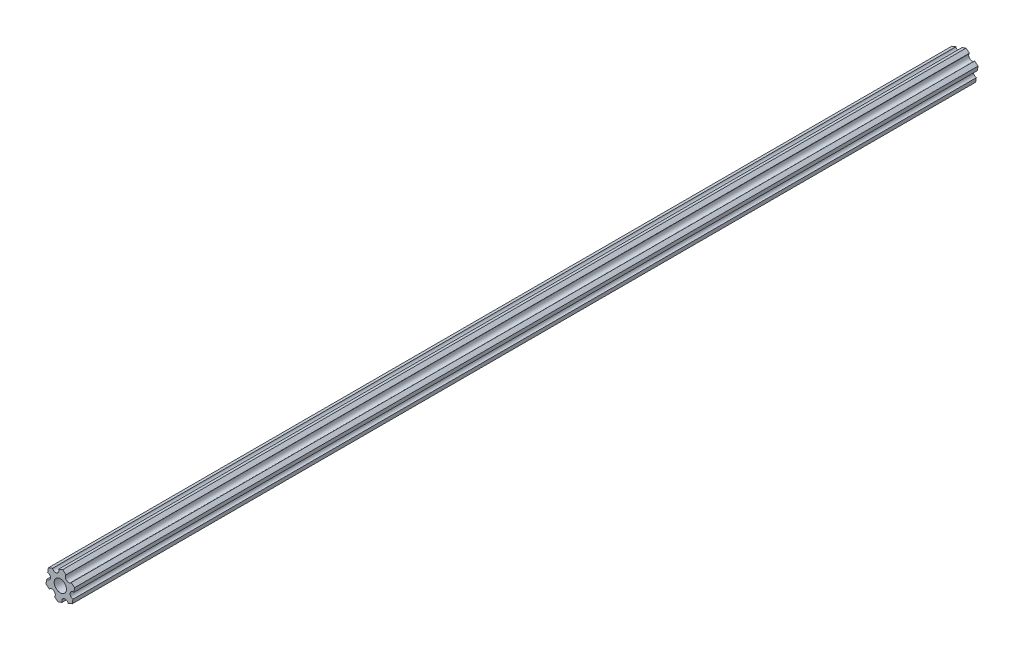
ISO-10303-21;
HEADER;
FILE_DESCRIPTION(('STEP AP214'),'2;1');
FILE_NAME('part.step','',(''),(''),'','','');
FILE_SCHEMA(('AUTOMOTIVE_DESIGN { 1 0 10303 214 1 1 1 1 }'));
ENDSEC;
DATA;
#1=APPLICATION_CONTEXT('core data for automotive mechanical design processes');
#2=APPLICATION_PROTOCOL_DEFINITION('international standard','automotive_design',2000,#1);
#3=PRODUCT_CONTEXT('',#1,'mechanical');
#4=PRODUCT('Part','Part','',(#3));
#5=PRODUCT_RELATED_PRODUCT_CATEGORY('part','',(#4));
#6=PRODUCT_DEFINITION_FORMATION('','',#4);
#7=PRODUCT_DEFINITION_CONTEXT('part definition',#1,'design');
#8=PRODUCT_DEFINITION('design','',#6,#7);
#9=PRODUCT_DEFINITION_SHAPE('','',#8);
#10=(LENGTH_UNIT() NAMED_UNIT(*) SI_UNIT(.MILLI.,.METRE.));
#11=(NAMED_UNIT(*) PLANE_ANGLE_UNIT() SI_UNIT($,.RADIAN.));
#12=(NAMED_UNIT(*) SI_UNIT($,.STERADIAN.) SOLID_ANGLE_UNIT());
#13=UNCERTAINTY_MEASURE_WITH_UNIT(LENGTH_MEASURE(1.E-05),#10,'distance_accuracy_value','');
#14=(GEOMETRIC_REPRESENTATION_CONTEXT(3) GLOBAL_UNCERTAINTY_ASSIGNED_CONTEXT((#13)) GLOBAL_UNIT_ASSIGNED_CONTEXT((#10,
#11,#12)) REPRESENTATION_CONTEXT('',''));
#15=CARTESIAN_POINT('',(0.,0.,0.));
#16=DIRECTION('',(0.,0.,1.));
#17=DIRECTION('',(1.,0.,0.));
#18=AXIS2_PLACEMENT_3D('',#15,#16,#17);
#19=CARTESIAN_POINT('',(-2.28494257052432,5.92465504898013,431.8));
#20=DIRECTION('',(0.,0.,1.));
#21=DIRECTION('',(1.,0.,0.));
#22=AXIS2_PLACEMENT_3D('',#19,#20,#21);
#23=PLANE('',#22);
#24=DIRECTION('',(-0.778133202638211,0.628099290679428,0.));
#25=VECTOR('',#24,1.);
#26=CARTESIAN_POINT('',(2.7531440366259,5.93825346070648,431.8));
#27=LINE('',#26,#25);
#28=CARTESIAN_POINT('',(2.7531440366259,5.93825346070648,431.8));
#29=VERTEX_POINT('',#28);
#30=CARTESIAN_POINT('',(1.13565861686004,7.24386725715518,431.8));
#31=VERTEX_POINT('',#30);
#32=EDGE_CURVE('E225',#29,#31,#27,.T.);
#33=ORIENTED_EDGE('',*,*,#32,.T.);
#34=DIRECTION('',(-0.933016543146477,-0.359833475673121,0.));
#35=VECTOR('',#34,1.);
#36=CARTESIAN_POINT('',(1.13565861686004,7.24386725715518,431.8));
#37=LINE('',#36,#35);
#38=CARTESIAN_POINT('',(-0.803778808279283,6.49589069161121,431.8));
#39=VERTEX_POINT('',#38);
#40=EDGE_CURVE('E123',#31,#39,#37,.T.);
#41=ORIENTED_EDGE('',*,*,#40,.T.);
#42=CARTESIAN_POINT('',(-2.28494257052432,5.92465504898013,431.8));
#43=DIRECTION('',(0.,0.,-1.));
#44=DIRECTION('',(1.,0.,0.));
#45=AXIS2_PLACEMENT_3D('',#42,#43,#44);
#46=CIRCLE('',#45,1.5875);
#47=CARTESIAN_POINT('',(-3.76610633276935,5.35341940634905,431.8));
#48=VERTEX_POINT('',#47);
#49=EDGE_CURVE('E270',#39,#48,#46,.T.);
#50=ORIENTED_EDGE('',*,*,#49,.T.);
#51=DIRECTION('',(-0.933016543146477,-0.359833475673121,0.));
#52=VECTOR('',#51,1.);
#53=CARTESIAN_POINT('',(-3.76610633276935,5.35341940634905,431.8));
#54=LINE('',#53,#52);
#55=CARTESIAN_POINT('',(-5.70554375790867,4.60544284080508,431.8));
#56=VERTEX_POINT('',#55);
#57=EDGE_CURVE('E289',#48,#56,#54,.T.);
#58=ORIENTED_EDGE('',*,*,#57,.T.);
#59=DIRECTION('',(-0.154883340508266,-0.987932766352549,0.));
#60=VECTOR('',#59,1.);
#61=CARTESIAN_POINT('',(-5.70554375790867,4.60544284080508,431.8));
#62=LINE('',#61,#60);
#63=CARTESIAN_POINT('',(-6.02749576328176,2.5518524788125,431.8));
#64=VERTEX_POINT('',#63);
#65=EDGE_CURVE('E286',#56,#64,#62,.T.);
#66=ORIENTED_EDGE('',*,*,#65,.T.);
#67=CARTESIAN_POINT('',(-6.27337306633831,0.983509212227633,431.8));
#68=DIRECTION('',(0.,0.,-1.));
#69=DIRECTION('',(1.,0.,0.));
#70=AXIS2_PLACEMENT_3D('',#67,#68,#69);
#71=CIRCLE('',#70,1.5875);
#72=CARTESIAN_POINT('',(-6.51925036939553,-0.584834054356986,431.8));
#73=VERTEX_POINT('',#72);
#74=EDGE_CURVE('E288',#64,#73,#71,.T.);
#75=ORIENTED_EDGE('',*,*,#74,.T.);
#76=DIRECTION('',(-0.154883340508266,-0.987932766352549,0.));
#77=VECTOR('',#76,1.);
#78=CARTESIAN_POINT('',(-6.5192503693955,-0.584834054356841,431.8));
#79=LINE('',#78,#77);
#80=CARTESIAN_POINT('',(-6.8412023747687,-2.6384244163501,431.8));
#81=VERTEX_POINT('',#80);
#82=EDGE_CURVE('E291',#73,#81,#79,.T.);
#83=ORIENTED_EDGE('',*,*,#82,.T.);
#84=DIRECTION('',(0.778133202638211,-0.628099290679428,0.));
#85=VECTOR('',#84,1.);
#86=CARTESIAN_POINT('',(-6.8412023747687,-2.6384244163501,431.8));
#87=LINE('',#86,#85);
#88=CARTESIAN_POINT('',(-5.22371695500254,-3.94403821279904,431.8));
#89=VERTEX_POINT('',#88);
#90=EDGE_CURVE('E297',#81,#89,#87,.T.);
#91=ORIENTED_EDGE('',*,*,#90,.T.);
#92=CARTESIAN_POINT('',(-3.98843049581394,-4.9411458367521,431.8));
#93=DIRECTION('',(0.,0.,-1.));
#94=DIRECTION('',(1.,0.,0.));
#95=AXIS2_PLACEMENT_3D('',#92,#93,#94);
#96=CIRCLE('',#95,1.58750000000001);
#97=CARTESIAN_POINT('',(-2.7531440366262,-5.93825346070624,431.8));
#98=VERTEX_POINT('',#97);
#99=EDGE_CURVE('E299',#89,#98,#96,.T.);
#100=ORIENTED_EDGE('',*,*,#99,.T.);
#101=DIRECTION('',(0.778133202638211,-0.628099290679428,0.));
#102=VECTOR('',#101,1.);
#103=CARTESIAN_POINT('',(-2.7531440366262,-5.93825346070624,431.8));
#104=LINE('',#103,#102);
#105=CARTESIAN_POINT('',(-1.13565861686003,-7.24386725715518,431.8));
#106=VERTEX_POINT('',#105);
#107=EDGE_CURVE('E301',#98,#106,#104,.T.);
#108=ORIENTED_EDGE('',*,*,#107,.T.);
#109=DIRECTION('',(0.933016543146476,0.359833475673123,0.));
#110=VECTOR('',#109,1.);
#111=CARTESIAN_POINT('',(-1.13565861686003,-7.24386725715518,431.8));
#112=LINE('',#111,#110);
#113=CARTESIAN_POINT('',(0.803778808279654,-6.49589069161106,431.8));
#114=VERTEX_POINT('',#113);
#115=EDGE_CURVE('E303',#106,#114,#112,.T.);
#116=ORIENTED_EDGE('',*,*,#115,.T.);
#117=CARTESIAN_POINT('',(2.28494257052444,-5.92465504897934,431.8));
#118=DIRECTION('',(0.,0.,-1.));
#119=DIRECTION('',(1.,0.,0.));
#120=AXIS2_PLACEMENT_3D('',#117,#118,#119);
#121=CIRCLE('',#120,1.5875);
#122=CARTESIAN_POINT('',(3.76610633276972,-5.35341940634891,431.8));
#123=VERTEX_POINT('',#122);
#124=EDGE_CURVE('E305',#114,#123,#121,.T.);
#125=ORIENTED_EDGE('',*,*,#124,.T.);
#126=DIRECTION('',(0.933016543146476,0.359833475673122,0.));
#127=VECTOR('',#126,1.);
#128=CARTESIAN_POINT('',(3.76610633276972,-5.35341940634891,431.8));
#129=LINE('',#128,#127);
#130=CARTESIAN_POINT('',(5.70554375790867,-4.60544284080507,431.8));
#131=VERTEX_POINT('',#130);
#132=EDGE_CURVE('E307',#123,#131,#129,.T.);
#133=ORIENTED_EDGE('',*,*,#132,.T.);
#134=DIRECTION('',(0.154883340508265,0.987932766352549,0.));
#135=VECTOR('',#134,1.);
#136=CARTESIAN_POINT('',(5.70554375790867,-4.60544284080507,431.8));
#137=LINE('',#136,#135);
#138=CARTESIAN_POINT('',(6.02749576328191,-2.55185247881157,431.8));
#139=VERTEX_POINT('',#138);
#140=EDGE_CURVE('E309',#131,#139,#137,.T.);
#141=ORIENTED_EDGE('',*,*,#140,.T.);
#142=CARTESIAN_POINT('',(6.27337306633844,-0.983509212226843,431.8));
#143=DIRECTION('',(0.,0.,-1.));
#144=DIRECTION('',(1.,0.,0.));
#145=AXIS2_PLACEMENT_3D('',#142,#143,#144);
#146=CIRCLE('',#145,1.5875);
#147=CARTESIAN_POINT('',(6.51925036939565,0.584834054357775,431.8));
#148=VERTEX_POINT('',#147);
#149=EDGE_CURVE('E172',#139,#148,#146,.T.);
#150=ORIENTED_EDGE('',*,*,#149,.T.);
#151=DIRECTION('',(0.154883340508267,0.987932766352549,0.));
#152=VECTOR('',#151,1.);
#153=CARTESIAN_POINT('',(6.51925036939565,0.584834054357776,431.8));
#154=LINE('',#153,#152);
#155=CARTESIAN_POINT('',(6.84120237476871,2.6384244163501,431.8));
#156=VERTEX_POINT('',#155);
#157=EDGE_CURVE('E166',#148,#156,#154,.T.);
#158=ORIENTED_EDGE('',*,*,#157,.T.);
#159=DIRECTION('',(-0.778133202638211,0.628099290679428,0.));
#160=VECTOR('',#159,1.);
#161=CARTESIAN_POINT('',(6.84120237476871,2.6384244163501,431.8));
#162=LINE('',#161,#160);
#163=CARTESIAN_POINT('',(5.22371695500222,3.9440382127993,431.8));
#164=VERTEX_POINT('',#163);
#165=EDGE_CURVE('E170',#156,#164,#162,.T.);
#166=ORIENTED_EDGE('',*,*,#165,.T.);
#167=CARTESIAN_POINT('',(3.98843049581406,4.94114583675289,431.8));
#168=DIRECTION('',(0.,0.,-1.));
#169=DIRECTION('',(1.,0.,0.));
#170=AXIS2_PLACEMENT_3D('',#167,#168,#169);
#171=CIRCLE('',#170,1.5875);
#172=EDGE_CURVE('E50',#164,#29,#171,.T.);
#173=ORIENTED_EDGE('',*,*,#172,.T.);
#174=EDGE_LOOP('',(#33,#41,#50,#58,#66,#75,#83,#91,#100,#108,#116,#125,#133,#141,#150,#158,#166,#173));
#175=FACE_BOUND('',#174,.T.);
#176=CARTESIAN_POINT('',(0.,0.,431.8));
#177=DIRECTION('',(0.,0.,1.));
#178=DIRECTION('',(1.,0.,0.));
#179=AXIS2_PLACEMENT_3D('',#176,#177,#178);
#180=CIRCLE('',#179,2.9337);
#181=CARTESIAN_POINT('',(2.9337,0.,431.8));
#182=VERTEX_POINT('',#181);
#183=EDGE_CURVE('E194',#182,#182,#180,.T.);
#184=ORIENTED_EDGE('',*,*,#183,.F.);
#185=EDGE_LOOP('',(#184));
#186=FACE_BOUND('',#185,.T.);
#187=ADVANCED_FACE('F33',(#175,#186),#23,.T.);
#188=CARTESIAN_POINT('',(-2.28494257052432,5.92465504898013,0.));
#189=DIRECTION('',(0.,0.,1.));
#190=DIRECTION('',(1.,0.,0.));
#191=AXIS2_PLACEMENT_3D('',#188,#189,#190);
#192=PLANE('',#191);
#193=DIRECTION('',(-0.778133202638211,0.628099290679428,0.));
#194=VECTOR('',#193,1.);
#195=CARTESIAN_POINT('',(2.7531440366259,5.93825346070648,0.));
#196=LINE('',#195,#194);
#197=CARTESIAN_POINT('',(2.7531440366259,5.93825346070648,0.));
#198=VERTEX_POINT('',#197);
#199=CARTESIAN_POINT('',(1.13565861686004,7.24386725715518,0.));
#200=VERTEX_POINT('',#199);
#201=EDGE_CURVE('E190',#198,#200,#196,.T.);
#202=ORIENTED_EDGE('',*,*,#201,.F.);
#203=CARTESIAN_POINT('',(3.98843049581406,4.94114583675289,0.));
#204=DIRECTION('',(0.,0.,-1.));
#205=DIRECTION('',(1.,0.,0.));
#206=AXIS2_PLACEMENT_3D('',#203,#204,#205);
#207=CIRCLE('',#206,1.5875);
#208=CARTESIAN_POINT('',(5.22371695500222,3.9440382127993,0.));
#209=VERTEX_POINT('',#208);
#210=EDGE_CURVE('E115',#209,#198,#207,.T.);
#211=ORIENTED_EDGE('',*,*,#210,.F.);
#212=DIRECTION('',(-0.778133202638211,0.628099290679428,0.));
#213=VECTOR('',#212,1.);
#214=CARTESIAN_POINT('',(6.84120237476871,2.6384244163501,0.));
#215=LINE('',#214,#213);
#216=CARTESIAN_POINT('',(6.84120237476871,2.6384244163501,0.));
#217=VERTEX_POINT('',#216);
#218=EDGE_CURVE('E109',#217,#209,#215,.T.);
#219=ORIENTED_EDGE('',*,*,#218,.F.);
#220=DIRECTION('',(0.154883340508267,0.987932766352549,0.));
#221=VECTOR('',#220,1.);
#222=CARTESIAN_POINT('',(6.51925036939565,0.584834054357776,0.));
#223=LINE('',#222,#221);
#224=CARTESIAN_POINT('',(6.51925036939565,0.584834054357775,0.));
#225=VERTEX_POINT('',#224);
#226=EDGE_CURVE('E180',#225,#217,#223,.T.);
#227=ORIENTED_EDGE('',*,*,#226,.F.);
#228=CARTESIAN_POINT('',(6.27337306633844,-0.983509212226843,0.));
#229=DIRECTION('',(0.,0.,-1.));
#230=DIRECTION('',(1.,0.,0.));
#231=AXIS2_PLACEMENT_3D('',#228,#229,#230);
#232=CIRCLE('',#231,1.5875);
#233=CARTESIAN_POINT('',(6.02749576328191,-2.55185247881157,0.));
#234=VERTEX_POINT('',#233);
#235=EDGE_CURVE('E220',#234,#225,#232,.T.);
#236=ORIENTED_EDGE('',*,*,#235,.F.);
#237=DIRECTION('',(0.154883340508265,0.987932766352549,0.));
#238=VECTOR('',#237,1.);
#239=CARTESIAN_POINT('',(5.70554375790867,-4.60544284080507,0.));
#240=LINE('',#239,#238);
#241=CARTESIAN_POINT('',(5.70554375790867,-4.60544284080507,0.));
#242=VERTEX_POINT('',#241);
#243=EDGE_CURVE('E218',#242,#234,#240,.T.);
#244=ORIENTED_EDGE('',*,*,#243,.F.);
#245=DIRECTION('',(0.933016543146476,0.359833475673122,0.));
#246=VECTOR('',#245,1.);
#247=CARTESIAN_POINT('',(3.76610633276972,-5.35341940634891,0.));
#248=LINE('',#247,#246);
#249=CARTESIAN_POINT('',(3.76610633276972,-5.35341940634891,0.));
#250=VERTEX_POINT('',#249);
#251=EDGE_CURVE('E216',#250,#242,#248,.T.);
#252=ORIENTED_EDGE('',*,*,#251,.F.);
#253=CARTESIAN_POINT('',(2.28494257052444,-5.92465504897934,0.));
#254=DIRECTION('',(0.,0.,-1.));
#255=DIRECTION('',(1.,0.,0.));
#256=AXIS2_PLACEMENT_3D('',#253,#254,#255);
#257=CIRCLE('',#256,1.5875);
#258=CARTESIAN_POINT('',(0.803778808279654,-6.49589069161106,0.));
#259=VERTEX_POINT('',#258);
#260=EDGE_CURVE('E214',#259,#250,#257,.T.);
#261=ORIENTED_EDGE('',*,*,#260,.F.);
#262=DIRECTION('',(0.933016543146476,0.359833475673123,0.));
#263=VECTOR('',#262,1.);
#264=CARTESIAN_POINT('',(-1.13565861686003,-7.24386725715518,0.));
#265=LINE('',#264,#263);
#266=CARTESIAN_POINT('',(-1.13565861686003,-7.24386725715518,0.));
#267=VERTEX_POINT('',#266);
#268=EDGE_CURVE('E212',#267,#259,#265,.T.);
#269=ORIENTED_EDGE('',*,*,#268,.F.);
#270=DIRECTION('',(0.778133202638211,-0.628099290679428,0.));
#271=VECTOR('',#270,1.);
#272=CARTESIAN_POINT('',(-2.7531440366262,-5.93825346070624,0.));
#273=LINE('',#272,#271);
#274=CARTESIAN_POINT('',(-2.7531440366262,-5.93825346070624,0.));
#275=VERTEX_POINT('',#274);
#276=EDGE_CURVE('E210',#275,#267,#273,.T.);
#277=ORIENTED_EDGE('',*,*,#276,.F.);
#278=CARTESIAN_POINT('',(-3.98843049581394,-4.9411458367521,0.));
#279=DIRECTION('',(0.,0.,-1.));
#280=DIRECTION('',(1.,0.,0.));
#281=AXIS2_PLACEMENT_3D('',#278,#279,#280);
#282=CIRCLE('',#281,1.58750000000001);
#283=CARTESIAN_POINT('',(-5.22371695500254,-3.94403821279904,0.));
#284=VERTEX_POINT('',#283);
#285=EDGE_CURVE('E208',#284,#275,#282,.T.);
#286=ORIENTED_EDGE('',*,*,#285,.F.);
#287=DIRECTION('',(0.778133202638211,-0.628099290679428,0.));
#288=VECTOR('',#287,1.);
#289=CARTESIAN_POINT('',(-6.8412023747687,-2.6384244163501,0.));
#290=LINE('',#289,#288);
#291=CARTESIAN_POINT('',(-6.8412023747687,-2.6384244163501,0.));
#292=VERTEX_POINT('',#291);
#293=EDGE_CURVE('E206',#292,#284,#290,.T.);
#294=ORIENTED_EDGE('',*,*,#293,.F.);
#295=DIRECTION('',(-0.154883340508266,-0.987932766352549,0.));
#296=VECTOR('',#295,1.);
#297=CARTESIAN_POINT('',(-6.5192503693955,-0.584834054356841,0.));
#298=LINE('',#297,#296);
#299=CARTESIAN_POINT('',(-6.51925036939553,-0.584834054356986,0.));
#300=VERTEX_POINT('',#299);
#301=EDGE_CURVE('E204',#300,#292,#298,.T.);
#302=ORIENTED_EDGE('',*,*,#301,.F.);
#303=CARTESIAN_POINT('',(-6.27337306633831,0.983509212227633,0.));
#304=DIRECTION('',(0.,0.,-1.));
#305=DIRECTION('',(1.,0.,0.));
#306=AXIS2_PLACEMENT_3D('',#303,#304,#305);
#307=CIRCLE('',#306,1.5875);
#308=CARTESIAN_POINT('',(-6.02749576328176,2.5518524788125,0.));
#309=VERTEX_POINT('',#308);
#310=EDGE_CURVE('E202',#309,#300,#307,.T.);
#311=ORIENTED_EDGE('',*,*,#310,.F.);
#312=DIRECTION('',(-0.154883340508266,-0.987932766352549,0.));
#313=VECTOR('',#312,1.);
#314=CARTESIAN_POINT('',(-5.70554375790867,4.60544284080508,0.));
#315=LINE('',#314,#313);
#316=CARTESIAN_POINT('',(-5.70554375790867,4.60544284080508,0.));
#317=VERTEX_POINT('',#316);
#318=EDGE_CURVE('E200',#317,#309,#315,.T.);
#319=ORIENTED_EDGE('',*,*,#318,.F.);
#320=DIRECTION('',(-0.933016543146477,-0.359833475673121,0.));
#321=VECTOR('',#320,1.);
#322=CARTESIAN_POINT('',(-3.76610633276935,5.35341940634905,0.));
#323=LINE('',#322,#321);
#324=CARTESIAN_POINT('',(-3.76610633276935,5.35341940634905,0.));
#325=VERTEX_POINT('',#324);
#326=EDGE_CURVE('E198',#325,#317,#323,.T.);
#327=ORIENTED_EDGE('',*,*,#326,.F.);
#328=CARTESIAN_POINT('',(-2.28494257052432,5.92465504898013,0.));
#329=DIRECTION('',(0.,0.,-1.));
#330=DIRECTION('',(1.,0.,0.));
#331=AXIS2_PLACEMENT_3D('',#328,#329,#330);
#332=CIRCLE('',#331,1.5875);
#333=CARTESIAN_POINT('',(-0.803778808279283,6.49589069161121,0.));
#334=VERTEX_POINT('',#333);
#335=EDGE_CURVE('E196',#334,#325,#332,.T.);
#336=ORIENTED_EDGE('',*,*,#335,.F.);
#337=DIRECTION('',(-0.933016543146477,-0.359833475673121,0.));
#338=VECTOR('',#337,1.);
#339=CARTESIAN_POINT('',(1.13565861686004,7.24386725715518,0.));
#340=LINE('',#339,#338);
#341=EDGE_CURVE('E193',#200,#334,#340,.T.);
#342=ORIENTED_EDGE('',*,*,#341,.F.);
#343=EDGE_LOOP('',(#202,#211,#219,#227,#236,#244,#252,#261,#269,#277,#286,#294,#302,#311,#319,
#327,#336,#342));
#344=FACE_BOUND('',#343,.T.);
#345=CARTESIAN_POINT('',(0.,0.,0.));
#346=DIRECTION('',(0.,0.,1.));
#347=DIRECTION('',(1.,0.,0.));
#348=AXIS2_PLACEMENT_3D('',#345,#346,#347);
#349=CIRCLE('',#348,2.9337);
#350=CARTESIAN_POINT('',(2.9337,0.,0.));
#351=VERTEX_POINT('',#350);
#352=EDGE_CURVE('E534',#351,#351,#349,.T.);
#353=ORIENTED_EDGE('',*,*,#352,.T.);
#354=EDGE_LOOP('',(#353));
#355=FACE_BOUND('',#354,.T.);
#356=ADVANCED_FACE('F274',(#344,#355),#192,.F.);
#357=CARTESIAN_POINT('',(2.7531440366259,5.93825346070648,431.8));
#358=DIRECTION('',(-0.628099290679428,-0.778133202638211,0.));
#359=DIRECTION('',(0.778133202638211,-0.628099290679428,0.));
#360=AXIS2_PLACEMENT_3D('',#357,#358,#359);
#361=PLANE('',#360);
#362=ORIENTED_EDGE('',*,*,#201,.T.);
#363=DIRECTION('',(0.,0.,-1.));
#364=VECTOR('',#363,1.);
#365=CARTESIAN_POINT('',(1.13565861686004,7.24386725715518,431.8));
#366=LINE('',#365,#364);
#367=EDGE_CURVE('E11',#31,#200,#366,.T.);
#368=ORIENTED_EDGE('',*,*,#367,.F.);
#369=ORIENTED_EDGE('',*,*,#32,.F.);
#370=DIRECTION('',(0.,0.,-1.));
#371=VECTOR('',#370,1.);
#372=CARTESIAN_POINT('',(2.7531440366259,5.93825346070648,431.8));
#373=LINE('',#372,#371);
#374=EDGE_CURVE('E186',#29,#198,#373,.T.);
#375=ORIENTED_EDGE('',*,*,#374,.T.);
#376=EDGE_LOOP('',(#362,#368,#369,#375));
#377=FACE_BOUND('',#376,.T.);
#378=ADVANCED_FACE('F35',(#377),#361,.F.);
#379=CARTESIAN_POINT('',(1.13565861686004,7.24386725715518,431.8));
#380=DIRECTION('',(0.359833475673121,-0.933016543146477,0.));
#381=DIRECTION('',(0.933016543146477,0.359833475673121,0.));
#382=AXIS2_PLACEMENT_3D('',#379,#380,#381);
#383=PLANE('',#382);
#384=ORIENTED_EDGE('',*,*,#341,.T.);
#385=DIRECTION('',(0.,0.,-1.));
#386=VECTOR('',#385,1.);
#387=CARTESIAN_POINT('',(-0.803778808279283,6.49589069161121,431.8));
#388=LINE('',#387,#386);
#389=EDGE_CURVE('E42',#39,#334,#388,.T.);
#390=ORIENTED_EDGE('',*,*,#389,.F.);
#391=ORIENTED_EDGE('',*,*,#40,.F.);
#392=ORIENTED_EDGE('',*,*,#367,.T.);
#393=EDGE_LOOP('',(#384,#390,#391,#392));
#394=FACE_BOUND('',#393,.T.);
#395=ADVANCED_FACE('F343',(#394),#383,.F.);
#396=CARTESIAN_POINT('',(-2.28494257052432,5.92465504898013,431.8));
#397=DIRECTION('',(0.,0.,-1.));
#398=DIRECTION('',(-1.,0.,0.));
#399=AXIS2_PLACEMENT_3D('',#396,#397,#398);
#400=CYLINDRICAL_SURFACE('',#399,1.5875);
#401=ORIENTED_EDGE('',*,*,#335,.T.);
#402=DIRECTION('',(0.,0.,-1.));
#403=VECTOR('',#402,1.);
#404=CARTESIAN_POINT('',(-3.76610633276935,5.35341940634905,431.8));
#405=LINE('',#404,#403);
#406=EDGE_CURVE('E262',#48,#325,#405,.T.);
#407=ORIENTED_EDGE('',*,*,#406,.F.);
#408=ORIENTED_EDGE('',*,*,#49,.F.);
#409=ORIENTED_EDGE('',*,*,#389,.T.);
#410=EDGE_LOOP('',(#401,#407,#408,#409));
#411=FACE_BOUND('',#410,.T.);
#412=ADVANCED_FACE('F268',(#411),#400,.F.);
#413=CARTESIAN_POINT('',(-3.76610633276935,5.35341940634905,431.8));
#414=DIRECTION('',(0.359833475673121,-0.933016543146477,0.));
#415=DIRECTION('',(0.933016543146477,0.359833475673121,0.));
#416=AXIS2_PLACEMENT_3D('',#413,#414,#415);
#417=PLANE('',#416);
#418=ORIENTED_EDGE('',*,*,#326,.T.);
#419=DIRECTION('',(0.,0.,-1.));
#420=VECTOR('',#419,1.);
#421=CARTESIAN_POINT('',(-5.70554375790867,4.60544284080508,431.8));
#422=LINE('',#421,#420);
#423=EDGE_CURVE('E259',#56,#317,#422,.T.);
#424=ORIENTED_EDGE('',*,*,#423,.F.);
#425=ORIENTED_EDGE('',*,*,#57,.F.);
#426=ORIENTED_EDGE('',*,*,#406,.T.);
#427=EDGE_LOOP('',(#418,#424,#425,#426));
#428=FACE_BOUND('',#427,.T.);
#429=ADVANCED_FACE('F280',(#428),#417,.F.);
#430=CARTESIAN_POINT('',(-5.70554375790867,4.60544284080508,431.8));
#431=DIRECTION('',(0.987932766352549,-0.154883340508266,0.));
#432=DIRECTION('',(0.154883340508266,0.987932766352549,0.));
#433=AXIS2_PLACEMENT_3D('',#430,#431,#432);
#434=PLANE('',#433);
#435=ORIENTED_EDGE('',*,*,#318,.T.);
#436=DIRECTION('',(0.,0.,-1.));
#437=VECTOR('',#436,1.);
#438=CARTESIAN_POINT('',(-6.02749576328176,2.5518524788125,431.8));
#439=LINE('',#438,#437);
#440=EDGE_CURVE('E256',#64,#309,#439,.T.);
#441=ORIENTED_EDGE('',*,*,#440,.F.);
#442=ORIENTED_EDGE('',*,*,#65,.F.);
#443=ORIENTED_EDGE('',*,*,#423,.T.);
#444=EDGE_LOOP('',(#435,#441,#442,#443));
#445=FACE_BOUND('',#444,.T.);
#446=ADVANCED_FACE('F284',(#445),#434,.F.);
#447=CARTESIAN_POINT('',(-6.27337306633831,0.983509212227633,431.8));
#448=DIRECTION('',(0.,0.,-1.));
#449=DIRECTION('',(-1.,0.,0.));
#450=AXIS2_PLACEMENT_3D('',#447,#448,#449);
#451=CYLINDRICAL_SURFACE('',#450,1.5875);
#452=ORIENTED_EDGE('',*,*,#310,.T.);
#453=DIRECTION('',(0.,0.,-1.));
#454=VECTOR('',#453,1.);
#455=CARTESIAN_POINT('',(-6.51925036939553,-0.584834054356986,431.8));
#456=LINE('',#455,#454);
#457=EDGE_CURVE('E253',#73,#300,#456,.T.);
#458=ORIENTED_EDGE('',*,*,#457,.F.);
#459=ORIENTED_EDGE('',*,*,#74,.F.);
#460=ORIENTED_EDGE('',*,*,#440,.T.);
#461=EDGE_LOOP('',(#452,#458,#459,#460));
#462=FACE_BOUND('',#461,.T.);
#463=ADVANCED_FACE('F356',(#462),#451,.F.);
#464=CARTESIAN_POINT('',(-6.5192503693955,-0.584834054356841,431.8));
#465=DIRECTION('',(0.987932766352549,-0.154883340508266,0.));
#466=DIRECTION('',(0.154883340508266,0.987932766352549,0.));
#467=AXIS2_PLACEMENT_3D('',#464,#465,#466);
#468=PLANE('',#467);
#469=ORIENTED_EDGE('',*,*,#301,.T.);
#470=DIRECTION('',(0.,0.,-1.));
#471=VECTOR('',#470,1.);
#472=CARTESIAN_POINT('',(-6.8412023747687,-2.6384244163501,431.8));
#473=LINE('',#472,#471);
#474=EDGE_CURVE('E250',#81,#292,#473,.T.);
#475=ORIENTED_EDGE('',*,*,#474,.F.);
#476=ORIENTED_EDGE('',*,*,#82,.F.);
#477=ORIENTED_EDGE('',*,*,#457,.T.);
#478=EDGE_LOOP('',(#469,#475,#476,#477));
#479=FACE_BOUND('',#478,.T.);
#480=ADVANCED_FACE('F359',(#479),#468,.F.);
#481=CARTESIAN_POINT('',(-6.8412023747687,-2.6384244163501,431.8));
#482=DIRECTION('',(0.628099290679428,0.778133202638211,0.));
#483=DIRECTION('',(-0.778133202638211,0.628099290679428,0.));
#484=AXIS2_PLACEMENT_3D('',#481,#482,#483);
#485=PLANE('',#484);
#486=ORIENTED_EDGE('',*,*,#293,.T.);
#487=DIRECTION('',(0.,0.,-1.));
#488=VECTOR('',#487,1.);
#489=CARTESIAN_POINT('',(-5.22371695500254,-3.94403821279904,431.8));
#490=LINE('',#489,#488);
#491=EDGE_CURVE('E247',#89,#284,#490,.T.);
#492=ORIENTED_EDGE('',*,*,#491,.F.);
#493=ORIENTED_EDGE('',*,*,#90,.F.);
#494=ORIENTED_EDGE('',*,*,#474,.T.);
#495=EDGE_LOOP('',(#486,#492,#493,#494));
#496=FACE_BOUND('',#495,.T.);
#497=ADVANCED_FACE('F363',(#496),#485,.F.);
#498=CARTESIAN_POINT('',(-3.98843049581394,-4.9411458367521,431.8));
#499=DIRECTION('',(0.,0.,-1.));
#500=DIRECTION('',(-1.,0.,0.));
#501=AXIS2_PLACEMENT_3D('',#498,#499,#500);
#502=CYLINDRICAL_SURFACE('',#501,1.58750000000001);
#503=ORIENTED_EDGE('',*,*,#285,.T.);
#504=DIRECTION('',(0.,0.,-1.));
#505=VECTOR('',#504,1.);
#506=CARTESIAN_POINT('',(-2.7531440366262,-5.93825346070624,431.8));
#507=LINE('',#506,#505);
#508=EDGE_CURVE('E244',#98,#275,#507,.T.);
#509=ORIENTED_EDGE('',*,*,#508,.F.);
#510=ORIENTED_EDGE('',*,*,#99,.F.);
#511=ORIENTED_EDGE('',*,*,#491,.T.);
#512=EDGE_LOOP('',(#503,#509,#510,#511));
#513=FACE_BOUND('',#512,.T.);
#514=ADVANCED_FACE('F367',(#513),#502,.F.);
#515=CARTESIAN_POINT('',(-2.7531440366262,-5.93825346070624,431.8));
#516=DIRECTION('',(0.628099290679428,0.778133202638211,0.));
#517=DIRECTION('',(-0.778133202638211,0.628099290679428,0.));
#518=AXIS2_PLACEMENT_3D('',#515,#516,#517);
#519=PLANE('',#518);
#520=ORIENTED_EDGE('',*,*,#276,.T.);
#521=DIRECTION('',(0.,0.,-1.));
#522=VECTOR('',#521,1.);
#523=CARTESIAN_POINT('',(-1.13565861686003,-7.24386725715518,431.8));
#524=LINE('',#523,#522);
#525=EDGE_CURVE('E241',#106,#267,#524,.T.);
#526=ORIENTED_EDGE('',*,*,#525,.F.);
#527=ORIENTED_EDGE('',*,*,#107,.F.);
#528=ORIENTED_EDGE('',*,*,#508,.T.);
#529=EDGE_LOOP('',(#520,#526,#527,#528));
#530=FACE_BOUND('',#529,.T.);
#531=ADVANCED_FACE('F371',(#530),#519,.F.);
#532=CARTESIAN_POINT('',(-1.13565861686003,-7.24386725715518,431.8));
#533=DIRECTION('',(-0.359833475673123,0.933016543146476,0.));
#534=DIRECTION('',(-0.933016543146476,-0.359833475673123,0.));
#535=AXIS2_PLACEMENT_3D('',#532,#533,#534);
#536=PLANE('',#535);
#537=ORIENTED_EDGE('',*,*,#268,.T.);
#538=DIRECTION('',(0.,0.,-1.));
#539=VECTOR('',#538,1.);
#540=CARTESIAN_POINT('',(0.803778808279654,-6.49589069161106,431.8));
#541=LINE('',#540,#539);
#542=EDGE_CURVE('E238',#114,#259,#541,.T.);
#543=ORIENTED_EDGE('',*,*,#542,.F.);
#544=ORIENTED_EDGE('',*,*,#115,.F.);
#545=ORIENTED_EDGE('',*,*,#525,.T.);
#546=EDGE_LOOP('',(#537,#543,#544,#545));
#547=FACE_BOUND('',#546,.T.);
#548=ADVANCED_FACE('F375',(#547),#536,.F.);
#549=CARTESIAN_POINT('',(2.28494257052444,-5.92465504897934,431.8));
#550=DIRECTION('',(0.,0.,-1.));
#551=DIRECTION('',(-1.,0.,0.));
#552=AXIS2_PLACEMENT_3D('',#549,#550,#551);
#553=CYLINDRICAL_SURFACE('',#552,1.5875);
#554=ORIENTED_EDGE('',*,*,#260,.T.);
#555=DIRECTION('',(0.,0.,-1.));
#556=VECTOR('',#555,1.);
#557=CARTESIAN_POINT('',(3.76610633276972,-5.35341940634891,431.8));
#558=LINE('',#557,#556);
#559=EDGE_CURVE('E235',#123,#250,#558,.T.);
#560=ORIENTED_EDGE('',*,*,#559,.F.);
#561=ORIENTED_EDGE('',*,*,#124,.F.);
#562=ORIENTED_EDGE('',*,*,#542,.T.);
#563=EDGE_LOOP('',(#554,#560,#561,#562));
#564=FACE_BOUND('',#563,.T.);
#565=ADVANCED_FACE('F379',(#564),#553,.F.);
#566=CARTESIAN_POINT('',(3.76610633276972,-5.35341940634891,431.8));
#567=DIRECTION('',(-0.359833475673122,0.933016543146476,0.));
#568=DIRECTION('',(-0.933016543146476,-0.359833475673122,0.));
#569=AXIS2_PLACEMENT_3D('',#566,#567,#568);
#570=PLANE('',#569);
#571=ORIENTED_EDGE('',*,*,#251,.T.);
#572=DIRECTION('',(0.,0.,-1.));
#573=VECTOR('',#572,1.);
#574=CARTESIAN_POINT('',(5.70554375790867,-4.60544284080507,431.8));
#575=LINE('',#574,#573);
#576=EDGE_CURVE('E232',#131,#242,#575,.T.);
#577=ORIENTED_EDGE('',*,*,#576,.F.);
#578=ORIENTED_EDGE('',*,*,#132,.F.);
#579=ORIENTED_EDGE('',*,*,#559,.T.);
#580=EDGE_LOOP('',(#571,#577,#578,#579));
#581=FACE_BOUND('',#580,.T.);
#582=ADVANCED_FACE('F383',(#581),#570,.F.);
#583=CARTESIAN_POINT('',(5.70554375790867,-4.60544284080507,431.8));
#584=DIRECTION('',(-0.987932766352549,0.154883340508265,0.));
#585=DIRECTION('',(-0.154883340508265,-0.987932766352549,0.));
#586=AXIS2_PLACEMENT_3D('',#583,#584,#585);
#587=PLANE('',#586);
#588=ORIENTED_EDGE('',*,*,#243,.T.);
#589=DIRECTION('',(0.,0.,-1.));
#590=VECTOR('',#589,1.);
#591=CARTESIAN_POINT('',(6.02749576328191,-2.55185247881157,431.8));
#592=LINE('',#591,#590);
#593=EDGE_CURVE('E229',#139,#234,#592,.T.);
#594=ORIENTED_EDGE('',*,*,#593,.F.);
#595=ORIENTED_EDGE('',*,*,#140,.F.);
#596=ORIENTED_EDGE('',*,*,#576,.T.);
#597=EDGE_LOOP('',(#588,#594,#595,#596));
#598=FACE_BOUND('',#597,.T.);
#599=ADVANCED_FACE('F315',(#598),#587,.F.);
#600=CARTESIAN_POINT('',(6.27337306633844,-0.983509212226843,431.8));
#601=DIRECTION('',(0.,0.,-1.));
#602=DIRECTION('',(-1.,0.,0.));
#603=AXIS2_PLACEMENT_3D('',#600,#601,#602);
#604=CYLINDRICAL_SURFACE('',#603,1.5875);
#605=ORIENTED_EDGE('',*,*,#235,.T.);
#606=DIRECTION('',(0.,0.,-1.));
#607=VECTOR('',#606,1.);
#608=CARTESIAN_POINT('',(6.51925036939565,0.584834054357775,431.8));
#609=LINE('',#608,#607);
#610=EDGE_CURVE('E181',#148,#225,#609,.T.);
#611=ORIENTED_EDGE('',*,*,#610,.F.);
#612=ORIENTED_EDGE('',*,*,#149,.F.);
#613=ORIENTED_EDGE('',*,*,#593,.T.);
#614=EDGE_LOOP('',(#605,#611,#612,#613));
#615=FACE_BOUND('',#614,.T.);
#616=ADVANCED_FACE('F319',(#615),#604,.F.);
#617=CARTESIAN_POINT('',(6.51925036939565,0.584834054357776,431.8));
#618=DIRECTION('',(-0.987932766352549,0.154883340508267,0.));
#619=DIRECTION('',(-0.154883340508267,-0.987932766352549,0.));
#620=AXIS2_PLACEMENT_3D('',#617,#618,#619);
#621=PLANE('',#620);
#622=ORIENTED_EDGE('',*,*,#226,.T.);
#623=DIRECTION('',(0.,0.,-1.));
#624=VECTOR('',#623,1.);
#625=CARTESIAN_POINT('',(6.84120237476871,2.6384244163501,431.8));
#626=LINE('',#625,#624);
#627=EDGE_CURVE('E177',#156,#217,#626,.T.);
#628=ORIENTED_EDGE('',*,*,#627,.F.);
#629=ORIENTED_EDGE('',*,*,#157,.F.);
#630=ORIENTED_EDGE('',*,*,#610,.T.);
#631=EDGE_LOOP('',(#622,#628,#629,#630));
#632=FACE_BOUND('',#631,.T.);
#633=ADVANCED_FACE('F178',(#632),#621,.F.);
#634=CARTESIAN_POINT('',(6.84120237476871,2.6384244163501,431.8));
#635=DIRECTION('',(-0.628099290679428,-0.778133202638211,0.));
#636=DIRECTION('',(0.778133202638211,-0.628099290679428,0.));
#637=AXIS2_PLACEMENT_3D('',#634,#635,#636);
#638=PLANE('',#637);
#639=ORIENTED_EDGE('',*,*,#218,.T.);
#640=DIRECTION('',(0.,0.,-1.));
#641=VECTOR('',#640,1.);
#642=CARTESIAN_POINT('',(5.22371695500222,3.9440382127993,431.8));
#643=LINE('',#642,#641);
#644=EDGE_CURVE('E182',#164,#209,#643,.T.);
#645=ORIENTED_EDGE('',*,*,#644,.F.);
#646=ORIENTED_EDGE('',*,*,#165,.F.);
#647=ORIENTED_EDGE('',*,*,#627,.T.);
#648=EDGE_LOOP('',(#639,#645,#646,#647));
#649=FACE_BOUND('',#648,.T.);
#650=ADVANCED_FACE('F184',(#649),#638,.F.);
#651=CARTESIAN_POINT('',(3.98843049581406,4.94114583675289,431.8));
#652=DIRECTION('',(0.,0.,-1.));
#653=DIRECTION('',(-1.,0.,0.));
#654=AXIS2_PLACEMENT_3D('',#651,#652,#653);
#655=CYLINDRICAL_SURFACE('',#654,1.5875);
#656=ORIENTED_EDGE('',*,*,#210,.T.);
#657=ORIENTED_EDGE('',*,*,#374,.F.);
#658=ORIENTED_EDGE('',*,*,#172,.F.);
#659=ORIENTED_EDGE('',*,*,#644,.T.);
#660=EDGE_LOOP('',(#656,#657,#658,#659));
#661=FACE_BOUND('',#660,.T.);
#662=ADVANCED_FACE('F323',(#661),#655,.F.);
#663=CARTESIAN_POINT('',(0.,0.,431.8));
#664=DIRECTION('',(0.,0.,-1.));
#665=DIRECTION('',(-1.,0.,0.));
#666=AXIS2_PLACEMENT_3D('',#663,#664,#665);
#667=CYLINDRICAL_SURFACE('',#666,2.9337);
#668=ORIENTED_EDGE('',*,*,#183,.T.);
#669=EDGE_LOOP('',(#668));
#670=FACE_BOUND('',#669,.T.);
#671=ORIENTED_EDGE('',*,*,#352,.F.);
#672=EDGE_LOOP('',(#671));
#673=FACE_BOUND('',#672,.T.);
#674=ADVANCED_FACE('F325',(#670,#673),#667,.F.);
#675=CLOSED_SHELL('',(#187,#356,#378,#395,#412,#429,#446,#463,#480,#497,#514,#531,#548,#565,
#582,#599,#616,#633,#650,#662,#674));
#676=MANIFOLD_SOLID_BREP('B2',#675);
#677=ADVANCED_BREP_SHAPE_REPRESENTATION('',(#18,#676),#14);
#678=SHAPE_DEFINITION_REPRESENTATION(#9,#677);
ENDSEC;
END-ISO-10303-21;
